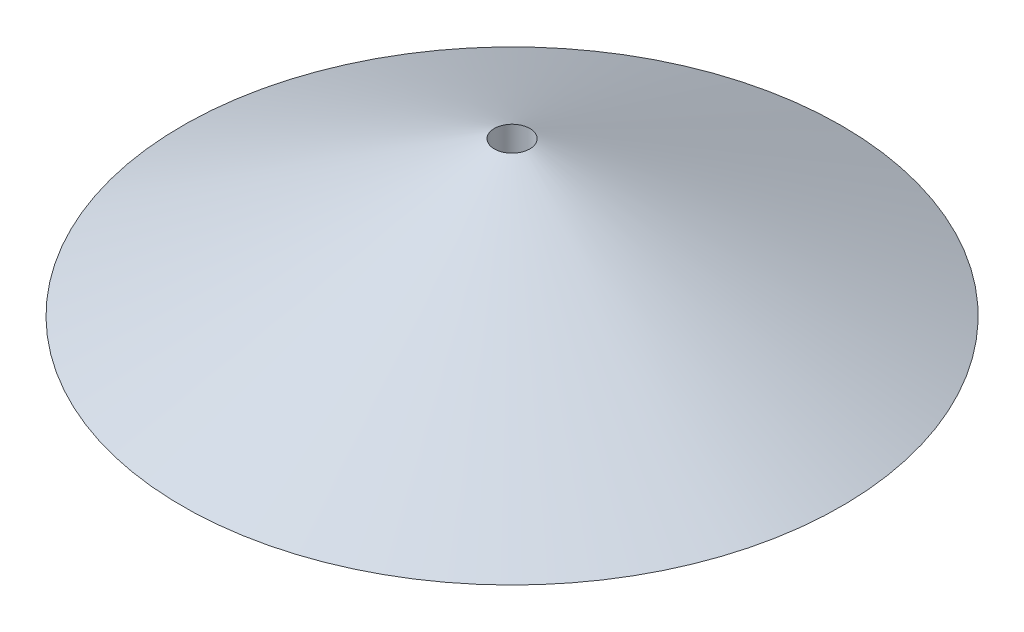
ISO-10303-21;
HEADER;
FILE_DESCRIPTION(('STEP AP214'),'2;1');
FILE_NAME('part.step','',(''),(''),'','','');
FILE_SCHEMA(('AUTOMOTIVE_DESIGN { 1 0 10303 214 1 1 1 1 }'));
ENDSEC;
DATA;
#1=APPLICATION_CONTEXT('core data for automotive mechanical design processes');
#2=APPLICATION_PROTOCOL_DEFINITION('international standard','automotive_design',2000,#1);
#3=PRODUCT_CONTEXT('',#1,'mechanical');
#4=PRODUCT('Part','Part','',(#3));
#5=PRODUCT_RELATED_PRODUCT_CATEGORY('part','',(#4));
#6=PRODUCT_DEFINITION_FORMATION('','',#4);
#7=PRODUCT_DEFINITION_CONTEXT('part definition',#1,'design');
#8=PRODUCT_DEFINITION('design','',#6,#7);
#9=PRODUCT_DEFINITION_SHAPE('','',#8);
#10=(LENGTH_UNIT() NAMED_UNIT(*) SI_UNIT(.MILLI.,.METRE.));
#11=(NAMED_UNIT(*) PLANE_ANGLE_UNIT() SI_UNIT($,.RADIAN.));
#12=(NAMED_UNIT(*) SI_UNIT($,.STERADIAN.) SOLID_ANGLE_UNIT());
#13=UNCERTAINTY_MEASURE_WITH_UNIT(LENGTH_MEASURE(1.E-05),#10,'distance_accuracy_value','');
#14=(GEOMETRIC_REPRESENTATION_CONTEXT(3) GLOBAL_UNCERTAINTY_ASSIGNED_CONTEXT((#13)) GLOBAL_UNIT_ASSIGNED_CONTEXT((#10,
#11,#12)) REPRESENTATION_CONTEXT('',''));
#15=CARTESIAN_POINT('',(0.,0.,0.));
#16=DIRECTION('',(0.,0.,1.));
#17=DIRECTION('',(1.,0.,0.));
#18=AXIS2_PLACEMENT_3D('',#15,#16,#17);
#19=CARTESIAN_POINT('',(0.,0.,0.));
#20=DIRECTION('',(0.,-1.,0.));
#21=DIRECTION('',(0.,0.,-1.));
#22=AXIS2_PLACEMENT_3D('',#19,#20,#21);
#23=CONICAL_SURFACE('',#22,32.5,1.11332147889887);
#24=CARTESIAN_POINT('',(0.,15.1384615384615,0.));
#25=DIRECTION('',(0.,-1.,0.));
#26=DIRECTION('',(0.,0.,-1.));
#27=AXIS2_PLACEMENT_3D('',#24,#25,#26);
#28=CIRCLE('',#27,1.75);
#29=CARTESIAN_POINT('',(0.,15.1384615384615,-1.75));
#30=VERTEX_POINT('',#29);
#31=EDGE_CURVE('E41',#30,#30,#28,.F.);
#32=CARTESIAN_POINT('',(0.,0.,0.));
#33=DIRECTION('',(0.,-1.,0.));
#34=DIRECTION('',(0.,0.,-1.));
#35=AXIS2_PLACEMENT_3D('',#32,#33,#34);
#36=CIRCLE('',#35,32.5);
#37=CARTESIAN_POINT('',(0.,0.,-32.5));
#38=VERTEX_POINT('',#37);
#39=EDGE_CURVE('E10',#38,#38,#36,.T.);
#40=CARTESIAN_POINT('',(0.,15.1384615384615,-1.75));
#41=CARTESIAN_POINT('',(0.,14.9807692307692,-2.0703125));
#42=CARTESIAN_POINT('',(0.,14.8230769230769,-2.390625));
#43=CARTESIAN_POINT('',(0.,14.5076923076923,-3.03125));
#44=CARTESIAN_POINT('',(0.,14.35,-3.3515625));
#45=CARTESIAN_POINT('',(0.,14.0346153846154,-3.9921875));
#46=CARTESIAN_POINT('',(0.,13.8769230769231,-4.3125));
#47=CARTESIAN_POINT('',(0.,13.5615384615385,-4.953125));
#48=CARTESIAN_POINT('',(0.,13.4038461538462,-5.2734375));
#49=CARTESIAN_POINT('',(0.,13.0884615384615,-5.9140625));
#50=CARTESIAN_POINT('',(0.,12.9307692307692,-6.234375));
#51=CARTESIAN_POINT('',(0.,12.6153846153846,-6.875));
#52=CARTESIAN_POINT('',(0.,12.4576923076923,-7.1953125));
#53=CARTESIAN_POINT('',(0.,12.1423076923077,-7.8359375));
#54=CARTESIAN_POINT('',(0.,11.9846153846154,-8.15625));
#55=CARTESIAN_POINT('',(0.,11.6692307692308,-8.796875));
#56=CARTESIAN_POINT('',(0.,11.5115384615385,-9.1171875));
#57=CARTESIAN_POINT('',(0.,11.1961538461538,-9.7578125));
#58=CARTESIAN_POINT('',(0.,11.0384615384615,-10.078125));
#59=CARTESIAN_POINT('',(0.,10.7230769230769,-10.71875));
#60=CARTESIAN_POINT('',(0.,10.5653846153846,-11.0390625));
#61=CARTESIAN_POINT('',(0.,10.25,-11.6796875));
#62=CARTESIAN_POINT('',(0.,10.0923076923077,-12.));
#63=CARTESIAN_POINT('',(0.,9.77692307692308,-12.640625));
#64=CARTESIAN_POINT('',(0.,9.61923076923077,-12.9609375));
#65=CARTESIAN_POINT('',(0.,9.30384615384616,-13.6015625));
#66=CARTESIAN_POINT('',(0.,9.14615384615385,-13.921875));
#67=CARTESIAN_POINT('',(0.,8.83076923076923,-14.5625));
#68=CARTESIAN_POINT('',(0.,8.67307692307693,-14.8828125));
#69=CARTESIAN_POINT('',(0.,8.35769230769231,-15.5234375));
#70=CARTESIAN_POINT('',(0.,8.2,-15.84375));
#71=CARTESIAN_POINT('',(0.,7.88461538461539,-16.484375));
#72=CARTESIAN_POINT('',(0.,7.72692307692308,-16.8046875));
#73=CARTESIAN_POINT('',(0.,7.41153846153846,-17.4453125));
#74=CARTESIAN_POINT('',(0.,7.25384615384616,-17.765625));
#75=CARTESIAN_POINT('',(0.,6.93846153846154,-18.40625));
#76=CARTESIAN_POINT('',(0.,6.78076923076923,-18.7265625));
#77=CARTESIAN_POINT('',(0.,6.46538461538462,-19.3671875));
#78=CARTESIAN_POINT('',(0.,6.30769230769231,-19.6875));
#79=CARTESIAN_POINT('',(0.,5.99230769230769,-20.328125));
#80=CARTESIAN_POINT('',(0.,5.83461538461539,-20.6484375));
#81=CARTESIAN_POINT('',(0.,5.51923076923077,-21.2890625));
#82=CARTESIAN_POINT('',(0.,5.36153846153846,-21.609375));
#83=CARTESIAN_POINT('',(0.,5.04615384615385,-22.25));
#84=CARTESIAN_POINT('',(0.,4.88846153846154,-22.5703125));
#85=CARTESIAN_POINT('',(0.,4.57307692307692,-23.2109375));
#86=CARTESIAN_POINT('',(0.,4.41538461538462,-23.53125));
#87=CARTESIAN_POINT('',(0.,4.1,-24.171875));
#88=CARTESIAN_POINT('',(0.,3.94230769230769,-24.4921875));
#89=CARTESIAN_POINT('',(0.,3.62692307692308,-25.1328125));
#90=CARTESIAN_POINT('',(0.,3.46923076923077,-25.453125));
#91=CARTESIAN_POINT('',(0.,3.15384615384616,-26.09375));
#92=CARTESIAN_POINT('',(0.,2.99615384615385,-26.4140625));
#93=CARTESIAN_POINT('',(0.,2.68076923076923,-27.0546875));
#94=CARTESIAN_POINT('',(0.,2.52307692307692,-27.375));
#95=CARTESIAN_POINT('',(0.,2.20769230769231,-28.015625));
#96=CARTESIAN_POINT('',(0.,2.05,-28.3359375));
#97=CARTESIAN_POINT('',(0.,1.73461538461539,-28.9765625));
#98=CARTESIAN_POINT('',(0.,1.57692307692308,-29.296875));
#99=CARTESIAN_POINT('',(0.,1.26153846153846,-29.9375));
#100=CARTESIAN_POINT('',(0.,1.10384615384615,-30.2578125));
#101=CARTESIAN_POINT('',(0.,0.788461538461539,-30.8984375));
#102=CARTESIAN_POINT('',(0.,0.630769230769231,-31.21875));
#103=CARTESIAN_POINT('',(0.,0.315384615384615,-31.859375));
#104=CARTESIAN_POINT('',(0.,0.157692307692307,-32.1796875));
#105=CARTESIAN_POINT('',(0.,0.,-32.5));
#106=B_SPLINE_CURVE_WITH_KNOTS('',3,(#40,#41,#42,#43,#44,#45,#46,#47,#48,#49,#50,#51,#52,#53,
#54,#55,#56,#57,#58,#59,#60,#61,#62,#63,#64,#65,#66,#67,#68,#69,#70,#71,#72,#73,#74,#75,#76,#77,
#78,#79,#80,#81,#82,#83,#84,#85,#86,#87,#88,#89,#90,#91,#92,#93,#94,#95,#96,#97,#98,#99,#100,
#101,#102,#103,#104,#105),.UNSPECIFIED.,.F.,.F.,(4,2,2,2,2,2,2,2,2,2,2,2,2,2,2,2,2,2,2,2,2,2,2,
2,2,2,2,2,2,2,2,2,4),(0.,1.07107546608733,2.14215093217465,3.21322639826198,4.2843018643493,
5.35537733043662,6.42645279652395,7.49752826261127,8.5686037286986,9.63967919478592,
10.7107546608732,11.7818301269606,12.8529055930479,13.9239810591352,14.9950565252225,
16.0661319913099,17.1372074573972,18.2082829234845,19.2793583895718,20.3504338556592,
21.4215093217465,22.4925847878338,23.5636602539211,24.6347357200085,25.7058111860958,
26.7768866521831,27.8479621182704,28.9190375843578,29.9901130504451,31.0611885165324,
32.1322639826197,33.2033394487071,34.2744149147944),.UNSPECIFIED.);
#107=EDGE_CURVE('BSEAM35',#30,#38,#106,.T.);
#108=ORIENTED_EDGE('',*,*,#31,.F.);
#109=ORIENTED_EDGE('',*,*,#39,.F.);
#110=ORIENTED_EDGE('',*,*,#107,.T.);
#111=ORIENTED_EDGE('',*,*,#107,.F.);
#112=EDGE_LOOP('',(#108,#110,#109,#111));
#113=FACE_BOUND('',#112,.T.);
#114=ADVANCED_FACE('F35',(#113),#23,.T.);
#115=CARTESIAN_POINT('',(0.,0.,0.));
#116=DIRECTION('',(0.,-1.,0.));
#117=DIRECTION('',(0.,0.,-1.));
#118=AXIS2_PLACEMENT_3D('',#115,#116,#117);
#119=PLANE('',#118);
#120=CARTESIAN_POINT('',(0.,0.,0.));
#121=DIRECTION('',(0.,-1.,0.));
#122=DIRECTION('',(0.,0.,-1.));
#123=AXIS2_PLACEMENT_3D('',#120,#121,#122);
#124=CIRCLE('',#123,1.75);
#125=CARTESIAN_POINT('',(0.,0.,-1.75));
#126=VERTEX_POINT('',#125);
#127=EDGE_CURVE('E45',#126,#126,#124,.T.);
#128=ORIENTED_EDGE('',*,*,#127,.F.);
#129=EDGE_LOOP('',(#128));
#130=FACE_BOUND('',#129,.T.);
#131=ORIENTED_EDGE('',*,*,#39,.T.);
#132=EDGE_LOOP('',(#131));
#133=FACE_BOUND('',#132,.T.);
#134=ADVANCED_FACE('F54',(#130,#133),#119,.T.);
#135=CARTESIAN_POINT('',(0.,16.,0.));
#136=DIRECTION('',(0.,-1.,0.));
#137=DIRECTION('',(0.,0.,-1.));
#138=AXIS2_PLACEMENT_3D('',#135,#136,#137);
#139=CYLINDRICAL_SURFACE('',#138,1.75);
#140=ORIENTED_EDGE('',*,*,#31,.T.);
#141=EDGE_LOOP('',(#140));
#142=FACE_BOUND('',#141,.T.);
#143=ORIENTED_EDGE('',*,*,#127,.T.);
#144=EDGE_LOOP('',(#143));
#145=FACE_BOUND('',#144,.T.);
#146=ADVANCED_FACE('F52',(#142,#145),#139,.F.);
#147=CLOSED_SHELL('',(#114,#134,#146));
#148=MANIFOLD_SOLID_BREP('B2',#147);
#149=ADVANCED_BREP_SHAPE_REPRESENTATION('',(#18,#148),#14);
#150=SHAPE_DEFINITION_REPRESENTATION(#9,#149);
ENDSEC;
END-ISO-10303-21;
